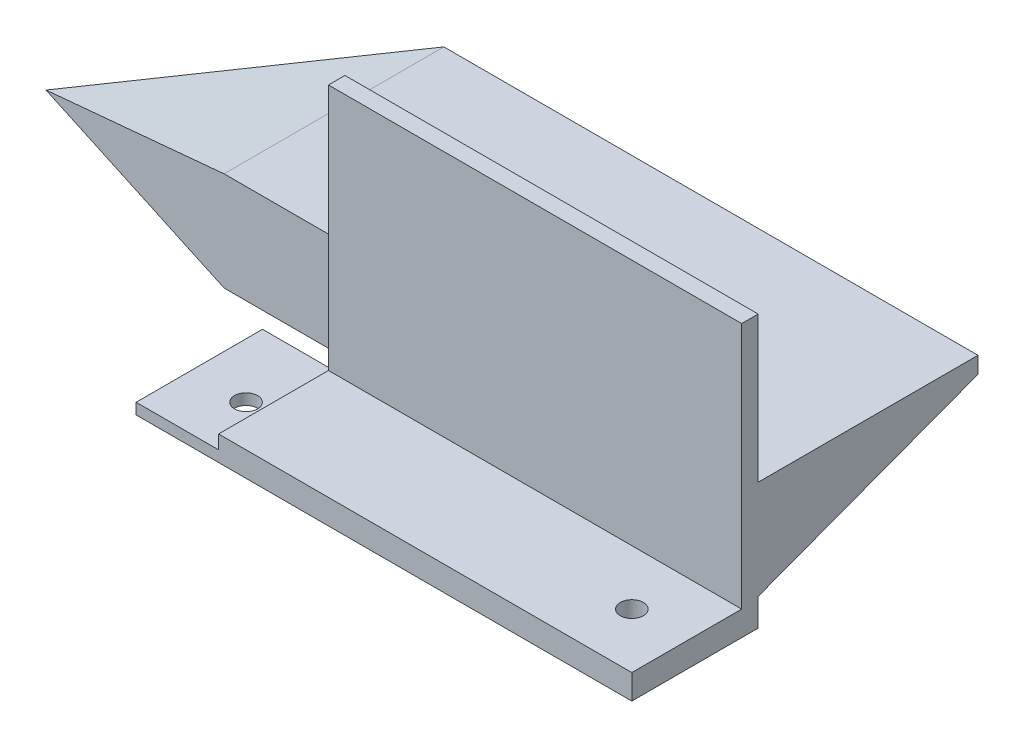
ISO-10303-21;
HEADER;
FILE_DESCRIPTION(('STEP AP214'),'2;1');
FILE_NAME('part.step','',(''),(''),'','','');
FILE_SCHEMA(('AUTOMOTIVE_DESIGN { 1 0 10303 214 1 1 1 1 }'));
ENDSEC;
DATA;
#1=APPLICATION_CONTEXT('core data for automotive mechanical design processes');
#2=APPLICATION_PROTOCOL_DEFINITION('international standard','automotive_design',2000,#1);
#3=PRODUCT_CONTEXT('',#1,'mechanical');
#4=PRODUCT('Part','Part','',(#3));
#5=PRODUCT_RELATED_PRODUCT_CATEGORY('part','',(#4));
#6=PRODUCT_DEFINITION_FORMATION('','',#4);
#7=PRODUCT_DEFINITION_CONTEXT('part definition',#1,'design');
#8=PRODUCT_DEFINITION('design','',#6,#7);
#9=PRODUCT_DEFINITION_SHAPE('','',#8);
#10=(LENGTH_UNIT() NAMED_UNIT(*) SI_UNIT(.MILLI.,.METRE.));
#11=(NAMED_UNIT(*) PLANE_ANGLE_UNIT() SI_UNIT($,.RADIAN.));
#12=(NAMED_UNIT(*) SI_UNIT($,.STERADIAN.) SOLID_ANGLE_UNIT());
#13=UNCERTAINTY_MEASURE_WITH_UNIT(LENGTH_MEASURE(1.E-05),#10,'distance_accuracy_value','');
#14=(GEOMETRIC_REPRESENTATION_CONTEXT(3) GLOBAL_UNCERTAINTY_ASSIGNED_CONTEXT((#13)) GLOBAL_UNIT_ASSIGNED_CONTEXT((#10,
#11,#12)) REPRESENTATION_CONTEXT('',''));
#15=CARTESIAN_POINT('',(0.,0.,0.));
#16=DIRECTION('',(0.,0.,1.));
#17=DIRECTION('',(1.,0.,0.));
#18=AXIS2_PLACEMENT_3D('',#15,#16,#17);
#19=CARTESIAN_POINT('',(36.5978593272171,2.,-38.8767584097859));
#20=DIRECTION('',(-1.,0.,0.));
#21=DIRECTION('',(0.,0.,-1.));
#22=AXIS2_PLACEMENT_3D('',#19,#20,#21);
#23=PLANE('',#22);
#24=DIRECTION('',(0.,-0.351123441588392,0.936329177569045));
#25=VECTOR('',#24,1.);
#26=CARTESIAN_POINT('',(36.5978593272171,-9.56878220434837,-3.58829332663065));
#27=LINE('',#26,#25);
#28=CARTESIAN_POINT('',(36.5978593272171,20.,-82.438379204893));
#29=VERTEX_POINT('',#28);
#30=CARTESIAN_POINT('',(36.5978593272171,5.,-42.438379204893));
#31=VERTEX_POINT('',#30);
#32=EDGE_CURVE('E348',#29,#31,#27,.T.);
#33=ORIENTED_EDGE('',*,*,#32,.F.);
#34=DIRECTION('',(0.,1.,0.));
#35=VECTOR('',#34,1.);
#36=CARTESIAN_POINT('',(36.5978593272171,0.,-82.438379204893));
#37=LINE('',#36,#35);
#38=CARTESIAN_POINT('',(36.5978593272171,23.,-82.438379204893));
#39=VERTEX_POINT('',#38);
#40=EDGE_CURVE('E340',#29,#39,#37,.T.);
#41=ORIENTED_EDGE('',*,*,#40,.T.);
#42=DIRECTION('',(0.,0.,1.));
#43=VECTOR('',#42,1.);
#44=CARTESIAN_POINT('',(36.5978593272171,23.,-82.438379204893));
#45=LINE('',#44,#43);
#46=CARTESIAN_POINT('',(36.5978593272171,23.,-42.438379204893));
#47=VERTEX_POINT('',#46);
#48=EDGE_CURVE('E53',#39,#47,#45,.T.);
#49=ORIENTED_EDGE('',*,*,#48,.T.);
#50=DIRECTION('',(0.,1.,0.));
#51=VECTOR('',#50,1.);
#52=CARTESIAN_POINT('',(36.5978593272171,49.5,-42.438379204893));
#53=LINE('',#52,#51);
#54=CARTESIAN_POINT('',(36.5978593272171,49.5,-42.438379204893));
#55=VERTEX_POINT('',#54);
#56=EDGE_CURVE('E306',#47,#55,#53,.T.);
#57=ORIENTED_EDGE('',*,*,#56,.T.);
#58=DIRECTION('',(0.,0.,1.));
#59=VECTOR('',#58,1.);
#60=CARTESIAN_POINT('',(36.5978593272171,49.5,-42.438379204893));
#61=LINE('',#60,#59);
#62=CARTESIAN_POINT('',(36.5978593272171,49.5,-39.438379204893));
#63=VERTEX_POINT('',#62);
#64=EDGE_CURVE('E259',#55,#63,#61,.T.);
#65=ORIENTED_EDGE('',*,*,#64,.T.);
#66=DIRECTION('',(0.,1.,0.));
#67=VECTOR('',#66,1.);
#68=CARTESIAN_POINT('',(36.5978593272171,49.5,-39.438379204893));
#69=LINE('',#68,#67);
#70=CARTESIAN_POINT('',(36.5978593272171,4.5,-39.438379204893));
#71=VERTEX_POINT('',#70);
#72=EDGE_CURVE('E298',#71,#63,#69,.T.);
#73=ORIENTED_EDGE('',*,*,#72,.F.);
#74=DIRECTION('',(0.,0.,1.));
#75=VECTOR('',#74,1.);
#76=CARTESIAN_POINT('',(36.5978593272171,4.5,-38.8767584097859));
#77=LINE('',#76,#75);
#78=CARTESIAN_POINT('',(36.5978593272171,4.5,-19.438379204893));
#79=VERTEX_POINT('',#78);
#80=EDGE_CURVE('E268',#71,#79,#77,.T.);
#81=ORIENTED_EDGE('',*,*,#80,.T.);
#82=DIRECTION('',(0.,-1.,0.));
#83=VECTOR('',#82,1.);
#84=CARTESIAN_POINT('',(36.5978593272171,2.,-19.438379204893));
#85=LINE('',#84,#83);
#86=CARTESIAN_POINT('',(36.5978593272171,0.,-19.438379204893));
#87=VERTEX_POINT('',#86);
#88=EDGE_CURVE('E45',#79,#87,#85,.T.);
#89=ORIENTED_EDGE('',*,*,#88,.T.);
#90=DIRECTION('',(0.,0.,1.));
#91=VECTOR('',#90,1.);
#92=CARTESIAN_POINT('',(36.5978593272171,0.,-38.8767584097859));
#93=LINE('',#92,#91);
#94=CARTESIAN_POINT('',(36.5978593272171,0.,-42.438379204893));
#95=VERTEX_POINT('',#94);
#96=EDGE_CURVE('E155',#95,#87,#93,.T.);
#97=ORIENTED_EDGE('',*,*,#96,.F.);
#98=EDGE_CURVE('E308',#95,#31,#53,.T.);
#99=ORIENTED_EDGE('',*,*,#98,.T.);
#100=EDGE_LOOP('',(#33,#41,#49,#57,#65,#73,#81,#89,#97,#99));
#101=FACE_BOUND('',#100,.T.);
#102=ADVANCED_FACE('F35',(#101),#23,.F.);
#103=CARTESIAN_POINT('',(0.,0.,-82.438379204893));
#104=DIRECTION('',(0.,0.,-1.));
#105=DIRECTION('',(1.,0.,0.));
#106=AXIS2_PLACEMENT_3D('',#103,#104,#105);
#107=PLANE('',#106);
#108=ORIENTED_EDGE('',*,*,#40,.F.);
#109=DIRECTION('',(-1.,0.,0.));
#110=VECTOR('',#109,1.);
#111=CARTESIAN_POINT('',(0.,20.,-82.438379204893));
#112=LINE('',#111,#110);
#113=CARTESIAN_POINT('',(-60.6021001727829,20.,-82.4384292048929));
#114=VERTEX_POINT('',#113);
#115=EDGE_CURVE('E11',#29,#114,#112,.T.);
#116=ORIENTED_EDGE('',*,*,#115,.T.);
#117=DIRECTION('',(0.,1.,0.));
#118=VECTOR('',#117,1.);
#119=CARTESIAN_POINT('',(-60.6021406727829,0.,-82.4383792048929));
#120=LINE('',#119,#118);
#121=CARTESIAN_POINT('',(-60.6021406727829,23.,-82.4383792048929));
#122=VERTEX_POINT('',#121);
#123=EDGE_CURVE('E168',#114,#122,#120,.T.);
#124=ORIENTED_EDGE('',*,*,#123,.T.);
#125=DIRECTION('',(-1.,0.,0.));
#126=VECTOR('',#125,1.);
#127=CARTESIAN_POINT('',(0.,23.,-82.438379204893));
#128=LINE('',#127,#126);
#129=EDGE_CURVE('E335',#39,#122,#128,.T.);
#130=ORIENTED_EDGE('',*,*,#129,.F.);
#131=EDGE_LOOP('',(#108,#116,#124,#130));
#132=FACE_BOUND('',#131,.T.);
#133=ADVANCED_FACE('F200',(#132),#107,.T.);
#134=CARTESIAN_POINT('',(-53.6021406727829,3.21261782078673,-37.6720267269909));
#135=DIRECTION('',(0.,0.936329177569044,0.351123441588392));
#136=DIRECTION('',(0.,0.351123441588392,-0.936329177569045));
#137=AXIS2_PLACEMENT_3D('',#134,#135,#136);
#138=PLANE('',#137);
#139=ORIENTED_EDGE('',*,*,#115,.F.);
#140=ORIENTED_EDGE('',*,*,#32,.T.);
#141=DIRECTION('',(1.,0.,0.));
#142=VECTOR('',#141,1.);
#143=CARTESIAN_POINT('',(0.,5.,-42.438379204893));
#144=LINE('',#143,#142);
#145=CARTESIAN_POINT('',(-38.6021406727829,5.,-42.4383792048929));
#146=VERTEX_POINT('',#145);
#147=EDGE_CURVE('E325',#146,#31,#144,.T.);
#148=ORIENTED_EDGE('',*,*,#147,.F.);
#149=DIRECTION('',(1.,0.,0.));
#150=VECTOR('',#149,1.);
#151=CARTESIAN_POINT('',(-60.6021406727829,5.,-42.4383792048929));
#152=LINE('',#151,#150);
#153=CARTESIAN_POINT('',(-60.6021406727829,5.,-42.4383792048929));
#154=VERTEX_POINT('',#153);
#155=EDGE_CURVE('E164',#154,#146,#152,.T.);
#156=ORIENTED_EDGE('',*,*,#155,.F.);
#157=DIRECTION('',(0.,-0.351123441588392,0.936329177569045));
#158=VECTOR('',#157,1.);
#159=CARTESIAN_POINT('',(-60.6021406727829,20.,-82.4383792048929));
#160=LINE('',#159,#158);
#161=EDGE_CURVE('E180',#154,#114,#160,.F.);
#162=ORIENTED_EDGE('',*,*,#161,.T.);
#163=EDGE_LOOP('',(#139,#140,#148,#156,#162));
#164=FACE_BOUND('',#163,.T.);
#165=ADVANCED_FACE('F196',(#164),#138,.F.);
#166=CARTESIAN_POINT('',(-38.6021406727829,4.5,-38.8767584097859));
#167=DIRECTION('',(1.,0.,0.));
#168=DIRECTION('',(0.,0.,1.));
#169=AXIS2_PLACEMENT_3D('',#166,#167,#168);
#170=PLANE('',#169);
#171=DIRECTION('',(0.,-1.,0.));
#172=VECTOR('',#171,1.);
#173=CARTESIAN_POINT('',(-38.6021406727829,23.,-42.4383792048929));
#174=LINE('',#173,#172);
#175=CARTESIAN_POINT('',(-38.6021406727829,23.,-42.4383792048929));
#176=VERTEX_POINT('',#175);
#177=EDGE_CURVE('E323',#176,#146,#174,.T.);
#178=ORIENTED_EDGE('',*,*,#177,.T.);
#179=DIRECTION('',(0.,-1.,0.));
#180=VECTOR('',#179,1.);
#181=CARTESIAN_POINT('',(-38.6021406727829,2.,-42.4383792048929));
#182=LINE('',#181,#180);
#183=CARTESIAN_POINT('',(-38.6021406727829,2.,-42.4383792048929));
#184=VERTEX_POINT('',#183);
#185=EDGE_CURVE('E315',#146,#184,#182,.T.);
#186=ORIENTED_EDGE('',*,*,#185,.T.);
#187=DIRECTION('',(0.,0.,-1.));
#188=VECTOR('',#187,1.);
#189=CARTESIAN_POINT('',(-38.6021406727829,2.,-38.8767584097859));
#190=LINE('',#189,#188);
#191=CARTESIAN_POINT('',(-38.6021406727829,2.,-19.438379204893));
#192=VERTEX_POINT('',#191);
#193=EDGE_CURVE('E254',#192,#184,#190,.T.);
#194=ORIENTED_EDGE('',*,*,#193,.F.);
#195=DIRECTION('',(0.,-1.,0.));
#196=VECTOR('',#195,1.);
#197=CARTESIAN_POINT('',(-38.6021406727829,4.5,-19.438379204893));
#198=LINE('',#197,#196);
#199=CARTESIAN_POINT('',(-38.6021406727829,4.5,-19.438379204893));
#200=VERTEX_POINT('',#199);
#201=EDGE_CURVE('E270',#200,#192,#198,.T.);
#202=ORIENTED_EDGE('',*,*,#201,.F.);
#203=DIRECTION('',(0.,0.,-1.));
#204=VECTOR('',#203,1.);
#205=CARTESIAN_POINT('',(-38.6021406727829,4.5,-38.8767584097859));
#206=LINE('',#205,#204);
#207=CARTESIAN_POINT('',(-38.6021406727829,4.5,-39.4383792048929));
#208=VERTEX_POINT('',#207);
#209=EDGE_CURVE('E256',#200,#208,#206,.T.);
#210=ORIENTED_EDGE('',*,*,#209,.T.);
#211=DIRECTION('',(0.,-1.,0.));
#212=VECTOR('',#211,1.);
#213=CARTESIAN_POINT('',(-38.6021406727829,2.,-39.4383792048929));
#214=LINE('',#213,#212);
#215=CARTESIAN_POINT('',(-38.6021406727829,49.5,-39.4383792048929));
#216=VERTEX_POINT('',#215);
#217=EDGE_CURVE('E303',#216,#208,#214,.T.);
#218=ORIENTED_EDGE('',*,*,#217,.F.);
#219=DIRECTION('',(0.,0.,1.));
#220=VECTOR('',#219,1.);
#221=CARTESIAN_POINT('',(-38.6021406727829,49.5,-42.4383792048929));
#222=LINE('',#221,#220);
#223=CARTESIAN_POINT('',(-38.6021406727829,49.5,-42.4383792048929));
#224=VERTEX_POINT('',#223);
#225=EDGE_CURVE('E293',#224,#216,#222,.T.);
#226=ORIENTED_EDGE('',*,*,#225,.F.);
#227=EDGE_CURVE('E288',#224,#176,#182,.T.);
#228=ORIENTED_EDGE('',*,*,#227,.T.);
#229=EDGE_LOOP('',(#178,#186,#194,#202,#210,#218,#226,#228));
#230=FACE_BOUND('',#229,.T.);
#231=ADVANCED_FACE('F199',(#230),#170,.F.);
#232=CARTESIAN_POINT('',(0.,0.,-42.438379204893));
#233=DIRECTION('',(0.,0.,1.));
#234=DIRECTION('',(-1.,0.,0.));
#235=AXIS2_PLACEMENT_3D('',#232,#233,#234);
#236=PLANE('',#235);
#237=ORIENTED_EDGE('',*,*,#147,.T.);
#238=ORIENTED_EDGE('',*,*,#98,.F.);
#239=DIRECTION('',(1.,0.,0.));
#240=VECTOR('',#239,1.);
#241=CARTESIAN_POINT('',(36.5978593272171,0.,-42.438379204893));
#242=LINE('',#241,#240);
#243=CARTESIAN_POINT('',(-53.6021406727829,0.,-42.4383792048929));
#244=VERTEX_POINT('',#243);
#245=EDGE_CURVE('E292',#244,#95,#242,.T.);
#246=ORIENTED_EDGE('',*,*,#245,.F.);
#247=DIRECTION('',(0.,-1.,0.));
#248=VECTOR('',#247,1.);
#249=CARTESIAN_POINT('',(-53.6021406727829,0.,-42.4383792048929));
#250=LINE('',#249,#248);
#251=CARTESIAN_POINT('',(-53.6021406727829,2.,-42.4383792048929));
#252=VERTEX_POINT('',#251);
#253=EDGE_CURVE('E138',#252,#244,#250,.T.);
#254=ORIENTED_EDGE('',*,*,#253,.F.);
#255=DIRECTION('',(-1.,0.,0.));
#256=VECTOR('',#255,1.);
#257=CARTESIAN_POINT('',(-53.6021406727829,2.,-42.4383792048929));
#258=LINE('',#257,#256);
#259=EDGE_CURVE('E283',#184,#252,#258,.T.);
#260=ORIENTED_EDGE('',*,*,#259,.F.);
#261=ORIENTED_EDGE('',*,*,#185,.F.);
#262=EDGE_LOOP('',(#237,#238,#246,#254,#260,#261));
#263=FACE_BOUND('',#262,.T.);
#264=ADVANCED_FACE('F209',(#263),#236,.F.);
#265=DIRECTION('',(-1.,0.,0.));
#266=VECTOR('',#265,1.);
#267=CARTESIAN_POINT('',(0.,23.,-42.438379204893));
#268=LINE('',#267,#266);
#269=EDGE_CURVE('E356',#47,#176,#268,.T.);
#270=ORIENTED_EDGE('',*,*,#269,.T.);
#271=ORIENTED_EDGE('',*,*,#227,.F.);
#272=DIRECTION('',(-1.,0.,0.));
#273=VECTOR('',#272,1.);
#274=CARTESIAN_POINT('',(-38.6021406727829,49.5,-42.4383792048929));
#275=LINE('',#274,#273);
#276=EDGE_CURVE('E314',#55,#224,#275,.T.);
#277=ORIENTED_EDGE('',*,*,#276,.F.);
#278=ORIENTED_EDGE('',*,*,#56,.F.);
#279=EDGE_LOOP('',(#270,#271,#277,#278));
#280=FACE_BOUND('',#279,.T.);
#281=ADVANCED_FACE('F212',(#280),#236,.F.);
#282=CARTESIAN_POINT('',(0.,2.,-19.438379204893));
#283=DIRECTION('',(0.,0.,-1.));
#284=DIRECTION('',(1.,0.,0.));
#285=AXIS2_PLACEMENT_3D('',#282,#283,#284);
#286=PLANE('',#285);
#287=DIRECTION('',(-1.,0.,0.));
#288=VECTOR('',#287,1.);
#289=CARTESIAN_POINT('',(0.,0.,-19.438379204893));
#290=LINE('',#289,#288);
#291=CARTESIAN_POINT('',(-53.6021406727829,0.,-19.438379204893));
#292=VERTEX_POINT('',#291);
#293=EDGE_CURVE('E144',#87,#292,#290,.T.);
#294=ORIENTED_EDGE('',*,*,#293,.F.);
#295=ORIENTED_EDGE('',*,*,#88,.F.);
#296=DIRECTION('',(-1.,0.,0.));
#297=VECTOR('',#296,1.);
#298=CARTESIAN_POINT('',(0.,4.5,-19.438379204893));
#299=LINE('',#298,#297);
#300=EDGE_CURVE('E253',#79,#200,#299,.T.);
#301=ORIENTED_EDGE('',*,*,#300,.T.);
#302=ORIENTED_EDGE('',*,*,#201,.T.);
#303=DIRECTION('',(-1.,0.,0.));
#304=VECTOR('',#303,1.);
#305=CARTESIAN_POINT('',(0.,2.,-19.438379204893));
#306=LINE('',#305,#304);
#307=CARTESIAN_POINT('',(-53.6021406727829,2.,-19.438379204893));
#308=VERTEX_POINT('',#307);
#309=EDGE_CURVE('E151',#192,#308,#306,.T.);
#310=ORIENTED_EDGE('',*,*,#309,.T.);
#311=DIRECTION('',(0.,-1.,0.));
#312=VECTOR('',#311,1.);
#313=CARTESIAN_POINT('',(-53.6021406727829,2.,-19.438379204893));
#314=LINE('',#313,#312);
#315=EDGE_CURVE('E135',#308,#292,#314,.T.);
#316=ORIENTED_EDGE('',*,*,#315,.T.);
#317=EDGE_LOOP('',(#294,#295,#301,#302,#310,#316));
#318=FACE_BOUND('',#317,.T.);
#319=ADVANCED_FACE('F147',(#318),#286,.F.);
#320=CARTESIAN_POINT('',(-53.6021406727829,2.,-38.8767584097859));
#321=DIRECTION('',(1.,0.,0.));
#322=DIRECTION('',(0.,0.,1.));
#323=AXIS2_PLACEMENT_3D('',#320,#321,#322);
#324=PLANE('',#323);
#325=DIRECTION('',(0.,0.,-1.));
#326=VECTOR('',#325,1.);
#327=CARTESIAN_POINT('',(-53.6021406727829,0.,-38.8767584097859));
#328=LINE('',#327,#326);
#329=EDGE_CURVE('E132',#292,#244,#328,.T.);
#330=ORIENTED_EDGE('',*,*,#329,.F.);
#331=ORIENTED_EDGE('',*,*,#315,.F.);
#332=DIRECTION('',(0.,0.,-1.));
#333=VECTOR('',#332,1.);
#334=CARTESIAN_POINT('',(-53.6021406727829,2.,-38.8767584097859));
#335=LINE('',#334,#333);
#336=EDGE_CURVE('E152',#308,#252,#335,.T.);
#337=ORIENTED_EDGE('',*,*,#336,.T.);
#338=ORIENTED_EDGE('',*,*,#253,.T.);
#339=EDGE_LOOP('',(#330,#331,#337,#338));
#340=FACE_BOUND('',#339,.T.);
#341=ADVANCED_FACE('F134',(#340),#324,.F.);
#342=CARTESIAN_POINT('',(26.5978593272171,2.,-29.438379204893));
#343=DIRECTION('',(0.,-1.,0.));
#344=DIRECTION('',(0.,0.,1.));
#345=AXIS2_PLACEMENT_3D('',#342,#343,#344);
#346=CYLINDRICAL_SURFACE('',#345,2.1);
#347=CARTESIAN_POINT('',(26.5978593272171,0.,-29.438379204893));
#348=DIRECTION('',(0.,-1.,0.));
#349=DIRECTION('',(0.,0.,-1.));
#350=AXIS2_PLACEMENT_3D('',#347,#348,#349);
#351=CIRCLE('',#350,2.1);
#352=CARTESIAN_POINT('',(26.5978593272171,0.,-31.538379204893));
#353=VERTEX_POINT('',#352);
#354=EDGE_CURVE('E158',#353,#353,#351,.T.);
#355=ORIENTED_EDGE('',*,*,#354,.T.);
#356=EDGE_LOOP('',(#355));
#357=FACE_BOUND('',#356,.T.);
#358=CARTESIAN_POINT('',(26.5978593272171,4.5,-29.438379204893));
#359=DIRECTION('',(0.,-1.,0.));
#360=DIRECTION('',(0.,0.,-1.));
#361=AXIS2_PLACEMENT_3D('',#358,#359,#360);
#362=CIRCLE('',#361,2.1);
#363=CARTESIAN_POINT('',(26.5978593272171,4.5,-31.538379204893));
#364=VERTEX_POINT('',#363);
#365=EDGE_CURVE('E252',#364,#364,#362,.F.);
#366=ORIENTED_EDGE('',*,*,#365,.T.);
#367=EDGE_LOOP('',(#366));
#368=FACE_BOUND('',#367,.T.);
#369=ADVANCED_FACE('F237',(#357,#368),#346,.F.);
#370=CARTESIAN_POINT('',(-43.6021406727829,2.,-29.438379204893));
#371=DIRECTION('',(0.,-1.,0.));
#372=DIRECTION('',(0.,0.,1.));
#373=AXIS2_PLACEMENT_3D('',#370,#371,#372);
#374=CYLINDRICAL_SURFACE('',#373,2.1);
#375=CARTESIAN_POINT('',(-43.6021406727829,2.,-29.438379204893));
#376=DIRECTION('',(0.,-1.,0.));
#377=DIRECTION('',(0.,0.,-1.));
#378=AXIS2_PLACEMENT_3D('',#375,#376,#377);
#379=CIRCLE('',#378,2.1);
#380=CARTESIAN_POINT('',(-43.6021406727829,2.,-31.5383792048929));
#381=VERTEX_POINT('',#380);
#382=EDGE_CURVE('E143',#381,#381,#379,.T.);
#383=ORIENTED_EDGE('',*,*,#382,.F.);
#384=EDGE_LOOP('',(#383));
#385=FACE_BOUND('',#384,.T.);
#386=CARTESIAN_POINT('',(-43.6021406727829,0.,-29.438379204893));
#387=DIRECTION('',(0.,-1.,0.));
#388=DIRECTION('',(0.,0.,-1.));
#389=AXIS2_PLACEMENT_3D('',#386,#387,#388);
#390=CIRCLE('',#389,2.1);
#391=CARTESIAN_POINT('',(-43.6021406727829,0.,-31.5383792048929));
#392=VERTEX_POINT('',#391);
#393=EDGE_CURVE('E273',#392,#392,#390,.T.);
#394=ORIENTED_EDGE('',*,*,#393,.T.);
#395=EDGE_LOOP('',(#394));
#396=FACE_BOUND('',#395,.T.);
#397=ADVANCED_FACE('F37',(#385,#396),#374,.F.);
#398=CARTESIAN_POINT('',(0.,2.,-38.8767584097859));
#399=DIRECTION('',(0.,1.,0.));
#400=DIRECTION('',(0.,0.,-1.));
#401=AXIS2_PLACEMENT_3D('',#398,#399,#400);
#402=PLANE('',#401);
#403=ORIENTED_EDGE('',*,*,#193,.T.);
#404=ORIENTED_EDGE('',*,*,#259,.T.);
#405=ORIENTED_EDGE('',*,*,#336,.F.);
#406=ORIENTED_EDGE('',*,*,#309,.F.);
#407=EDGE_LOOP('',(#403,#404,#405,#406));
#408=FACE_BOUND('',#407,.T.);
#409=ORIENTED_EDGE('',*,*,#382,.T.);
#410=EDGE_LOOP('',(#409));
#411=FACE_BOUND('',#410,.T.);
#412=ADVANCED_FACE('F228',(#408,#411),#402,.T.);
#413=CARTESIAN_POINT('',(0.,0.,-38.8767584097859));
#414=DIRECTION('',(0.,1.,0.));
#415=DIRECTION('',(0.,0.,-1.));
#416=AXIS2_PLACEMENT_3D('',#413,#414,#415);
#417=PLANE('',#416);
#418=ORIENTED_EDGE('',*,*,#393,.F.);
#419=EDGE_LOOP('',(#418));
#420=FACE_BOUND('',#419,.T.);
#421=ORIENTED_EDGE('',*,*,#354,.F.);
#422=EDGE_LOOP('',(#421));
#423=FACE_BOUND('',#422,.T.);
#424=ORIENTED_EDGE('',*,*,#96,.T.);
#425=ORIENTED_EDGE('',*,*,#293,.T.);
#426=ORIENTED_EDGE('',*,*,#329,.T.);
#427=ORIENTED_EDGE('',*,*,#245,.T.);
#428=EDGE_LOOP('',(#424,#425,#426,#427));
#429=FACE_BOUND('',#428,.T.);
#430=ADVANCED_FACE('F154',(#420,#423,#429),#417,.F.);
#431=CARTESIAN_POINT('',(0.,4.5,-38.8767584097859));
#432=DIRECTION('',(0.,1.,0.));
#433=DIRECTION('',(0.,0.,-1.));
#434=AXIS2_PLACEMENT_3D('',#431,#432,#433);
#435=PLANE('',#434);
#436=ORIENTED_EDGE('',*,*,#365,.F.);
#437=EDGE_LOOP('',(#436));
#438=FACE_BOUND('',#437,.T.);
#439=ORIENTED_EDGE('',*,*,#300,.F.);
#440=ORIENTED_EDGE('',*,*,#80,.F.);
#441=DIRECTION('',(1.,0.,0.));
#442=VECTOR('',#441,1.);
#443=CARTESIAN_POINT('',(0.,4.5,-39.438379204893));
#444=LINE('',#443,#442);
#445=EDGE_CURVE('E266',#208,#71,#444,.T.);
#446=ORIENTED_EDGE('',*,*,#445,.F.);
#447=ORIENTED_EDGE('',*,*,#209,.F.);
#448=EDGE_LOOP('',(#439,#440,#446,#447));
#449=FACE_BOUND('',#448,.T.);
#450=ADVANCED_FACE('F217',(#438,#449),#435,.T.);
#451=CARTESIAN_POINT('',(0.,0.,-39.438379204893));
#452=DIRECTION('',(0.,0.,1.));
#453=DIRECTION('',(-1.,0.,0.));
#454=AXIS2_PLACEMENT_3D('',#451,#452,#453);
#455=PLANE('',#454);
#456=ORIENTED_EDGE('',*,*,#445,.T.);
#457=ORIENTED_EDGE('',*,*,#72,.T.);
#458=DIRECTION('',(-1.,0.,0.));
#459=VECTOR('',#458,1.);
#460=CARTESIAN_POINT('',(-38.6021406727829,49.5,-39.4383792048929));
#461=LINE('',#460,#459);
#462=EDGE_CURVE('E301',#63,#216,#461,.T.);
#463=ORIENTED_EDGE('',*,*,#462,.T.);
#464=ORIENTED_EDGE('',*,*,#217,.T.);
#465=EDGE_LOOP('',(#456,#457,#463,#464));
#466=FACE_BOUND('',#465,.T.);
#467=ADVANCED_FACE('F214',(#466),#455,.T.);
#468=CARTESIAN_POINT('',(-38.6021406727829,49.5,-42.4383792048929));
#469=DIRECTION('',(0.,-1.,0.));
#470=DIRECTION('',(0.,0.,1.));
#471=AXIS2_PLACEMENT_3D('',#468,#469,#470);
#472=PLANE('',#471);
#473=ORIENTED_EDGE('',*,*,#462,.F.);
#474=ORIENTED_EDGE('',*,*,#64,.F.);
#475=ORIENTED_EDGE('',*,*,#276,.T.);
#476=ORIENTED_EDGE('',*,*,#225,.T.);
#477=EDGE_LOOP('',(#473,#474,#475,#476));
#478=FACE_BOUND('',#477,.T.);
#479=ADVANCED_FACE('F207',(#478),#472,.F.);
#480=CARTESIAN_POINT('',(0.,23.,-82.438379204893));
#481=DIRECTION('',(0.,-1.,0.));
#482=DIRECTION('',(0.,0.,1.));
#483=AXIS2_PLACEMENT_3D('',#480,#481,#482);
#484=PLANE('',#483);
#485=ORIENTED_EDGE('',*,*,#129,.T.);
#486=DIRECTION('',(0.,0.,-1.));
#487=VECTOR('',#486,1.);
#488=CARTESIAN_POINT('',(-60.6021406727829,23.,-38.8767584097859));
#489=LINE('',#488,#487);
#490=CARTESIAN_POINT('',(-60.6021406727828,23.,-42.4383792048929));
#491=VERTEX_POINT('',#490);
#492=EDGE_CURVE('E336',#122,#491,#489,.F.);
#493=ORIENTED_EDGE('',*,*,#492,.T.);
#494=DIRECTION('',(1.,0.,0.));
#495=VECTOR('',#494,1.);
#496=CARTESIAN_POINT('',(-60.6021406727829,23.,-42.4383792048929));
#497=LINE('',#496,#495);
#498=EDGE_CURVE('E167',#491,#176,#497,.T.);
#499=ORIENTED_EDGE('',*,*,#498,.T.);
#500=ORIENTED_EDGE('',*,*,#269,.F.);
#501=ORIENTED_EDGE('',*,*,#48,.F.);
#502=EDGE_LOOP('',(#485,#493,#499,#500,#501));
#503=FACE_BOUND('',#502,.T.);
#504=ADVANCED_FACE('F193',(#503),#484,.F.);
#505=CARTESIAN_POINT('',(-60.6021406727829,23.,-42.4383792048929));
#506=DIRECTION('',(0.,0.,-1.));
#507=DIRECTION('',(1.,0.,0.));
#508=AXIS2_PLACEMENT_3D('',#505,#506,#507);
#509=PLANE('',#508);
#510=ORIENTED_EDGE('',*,*,#177,.F.);
#511=ORIENTED_EDGE('',*,*,#498,.F.);
#512=DIRECTION('',(0.99574067405595,0.0921982105607363,0.));
#513=VECTOR('',#512,1.);
#514=CARTESIAN_POINT('',(-93.0021406727829,20.,-42.4383792048929));
#515=LINE('',#514,#513);
#516=CARTESIAN_POINT('',(-93.0021507977829,20.,-42.4383667048929));
#517=VERTEX_POINT('',#516);
#518=EDGE_CURVE('E67',#517,#491,#515,.T.);
#519=ORIENTED_EDGE('',*,*,#518,.F.);
#520=DIRECTION('',(-0.907466907119841,0.420123568111038,0.));
#521=VECTOR('',#520,1.);
#522=CARTESIAN_POINT('',(-93.0021406727829,20.,-42.4383792048929));
#523=LINE('',#522,#521);
#524=EDGE_CURVE('E174',#154,#517,#523,.T.);
#525=ORIENTED_EDGE('',*,*,#524,.F.);
#526=ORIENTED_EDGE('',*,*,#155,.T.);
#527=EDGE_LOOP('',(#510,#511,#519,#525,#526));
#528=FACE_BOUND('',#527,.T.);
#529=ADVANCED_FACE('F182',(#528),#509,.F.);
#530=CARTESIAN_POINT('',(-8.33431727491334,-18.0021253138128,-45.6275554024657));
#531=DIRECTION('',(0.397725154168529,0.859086333004022,0.322157374876508));
#532=DIRECTION('',(-0.907466907119841,0.420123568111038,0.));
#533=AXIS2_PLACEMENT_3D('',#530,#531,#532);
#534=PLANE('',#533);
#535=CARTESIAN_POINT('',(-93.0021406727829,20.,-42.4383792048929));
#536=DIRECTION('',(0.629421741569466,0.,-0.777063878480823));
#537=VECTOR('',#536,1.);
#538=LINE('',#535,#537);
#539=EDGE_CURVE('E346',#517,#114,#538,.T.);
#540=ORIENTED_EDGE('',*,*,#539,.T.);
#541=ORIENTED_EDGE('',*,*,#161,.F.);
#542=ORIENTED_EDGE('',*,*,#524,.T.);
#543=EDGE_LOOP('',(#540,#541,#542));
#544=FACE_BOUND('',#543,.T.);
#545=ADVANCED_FACE('F192',(#544),#534,.F.);
#546=CARTESIAN_POINT('',(-57.8993137593259,0.,-85.7752025548399));
#547=DIRECTION('',(-0.777063878480824,0.,-0.629421741569466));
#548=DIRECTION('',(0.629421741569466,0.,-0.777063878480824));
#549=AXIS2_PLACEMENT_3D('',#546,#547,#548);
#550=PLANE('',#549);
#551=ORIENTED_EDGE('',*,*,#539,.F.);
#552=DIRECTION('',(0.628355530687271,0.0581810676562289,-0.775747568749719));
#553=VECTOR('',#552,1.);
#554=CARTESIAN_POINT('',(-93.0021406727829,20.,-42.4383792048929));
#555=LINE('',#554,#553);
#556=EDGE_CURVE('E75',#517,#122,#555,.T.);
#557=ORIENTED_EDGE('',*,*,#556,.T.);
#558=ORIENTED_EDGE('',*,*,#123,.F.);
#559=EDGE_LOOP('',(#551,#557,#558));
#560=FACE_BOUND('',#559,.T.);
#561=ADVANCED_FACE('F344',(#560),#550,.T.);
#562=CARTESIAN_POINT('',(-2.62667579626644,28.3680985996775,-38.8767584097859));
#563=DIRECTION('',(-0.0921982105607363,0.99574067405595,0.));
#564=DIRECTION('',(-0.99574067405595,-0.0921982105607363,0.));
#565=AXIS2_PLACEMENT_3D('',#562,#563,#564);
#566=PLANE('',#565);
#567=ORIENTED_EDGE('',*,*,#556,.F.);
#568=ORIENTED_EDGE('',*,*,#518,.T.);
#569=ORIENTED_EDGE('',*,*,#492,.F.);
#570=EDGE_LOOP('',(#567,#568,#569));
#571=FACE_BOUND('',#570,.T.);
#572=ADVANCED_FACE('F351',(#571),#566,.T.);
#573=CLOSED_SHELL('',(#102,#133,#165,#231,#264,#281,#319,#341,#369,#397,#412,#430,#450,#467,
#479,#504,#529,#545,#561,#572));
#574=MANIFOLD_SOLID_BREP('B2',#573);
#575=ADVANCED_BREP_SHAPE_REPRESENTATION('',(#18,#574),#14);
#576=SHAPE_DEFINITION_REPRESENTATION(#9,#575);
ENDSEC;
END-ISO-10303-21;
